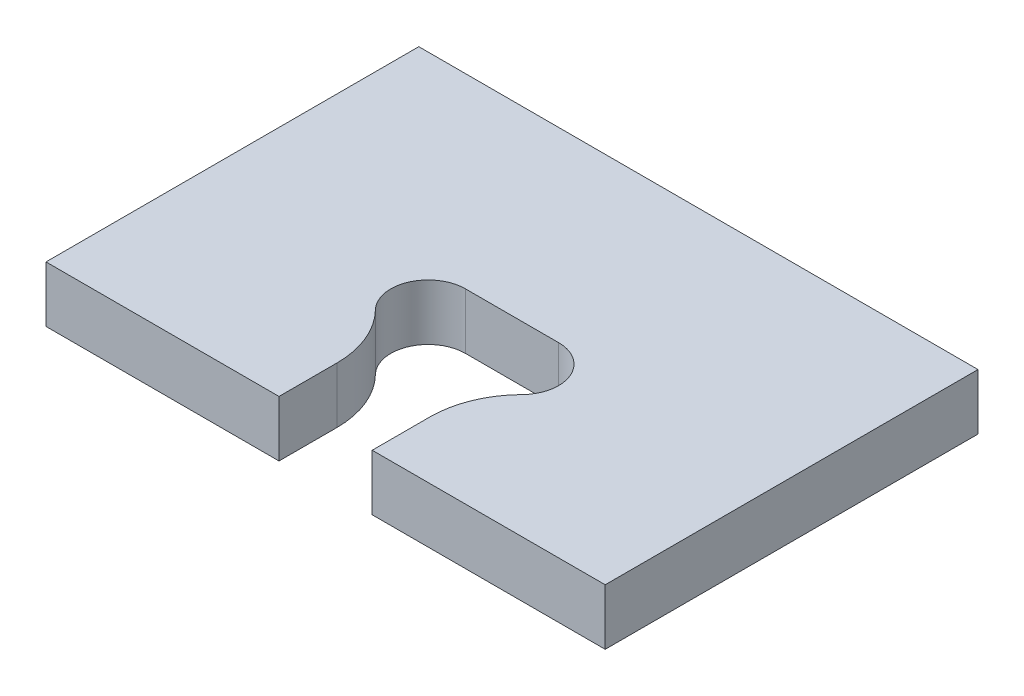
ISO-10303-21;
HEADER;
FILE_DESCRIPTION(('STEP AP214'),'2;1');
FILE_NAME('part.step','',(''),(''),'','','');
FILE_SCHEMA(('AUTOMOTIVE_DESIGN { 1 0 10303 214 1 1 1 1 }'));
ENDSEC;
DATA;
#1=APPLICATION_CONTEXT('core data for automotive mechanical design processes');
#2=APPLICATION_PROTOCOL_DEFINITION('international standard','automotive_design',2000,#1);
#3=PRODUCT_CONTEXT('',#1,'mechanical');
#4=PRODUCT('Part','Part','',(#3));
#5=PRODUCT_RELATED_PRODUCT_CATEGORY('part','',(#4));
#6=PRODUCT_DEFINITION_FORMATION('','',#4);
#7=PRODUCT_DEFINITION_CONTEXT('part definition',#1,'design');
#8=PRODUCT_DEFINITION('design','',#6,#7);
#9=PRODUCT_DEFINITION_SHAPE('','',#8);
#10=(LENGTH_UNIT() NAMED_UNIT(*) SI_UNIT(.MILLI.,.METRE.));
#11=(NAMED_UNIT(*) PLANE_ANGLE_UNIT() SI_UNIT($,.RADIAN.));
#12=(NAMED_UNIT(*) SI_UNIT($,.STERADIAN.) SOLID_ANGLE_UNIT());
#13=UNCERTAINTY_MEASURE_WITH_UNIT(LENGTH_MEASURE(1.E-05),#10,'distance_accuracy_value','');
#14=(GEOMETRIC_REPRESENTATION_CONTEXT(3) GLOBAL_UNCERTAINTY_ASSIGNED_CONTEXT((#13)) GLOBAL_UNIT_ASSIGNED_CONTEXT((#10,
#11,#12)) REPRESENTATION_CONTEXT('',''));
#15=CARTESIAN_POINT('',(0.,0.,0.));
#16=DIRECTION('',(0.,0.,1.));
#17=DIRECTION('',(1.,0.,0.));
#18=AXIS2_PLACEMENT_3D('',#15,#16,#17);
#19=CARTESIAN_POINT('',(-15.,3.,-20.));
#20=DIRECTION('',(1.,0.,0.));
#21=DIRECTION('',(0.,0.,-1.));
#22=AXIS2_PLACEMENT_3D('',#19,#20,#21);
#23=PLANE('',#22);
#24=DIRECTION('',(0.,0.,1.));
#25=VECTOR('',#24,1.);
#26=CARTESIAN_POINT('',(-15.,0.,-20.));
#27=LINE('',#26,#25);
#28=CARTESIAN_POINT('',(-15.,0.,-20.));
#29=VERTEX_POINT('',#28);
#30=CARTESIAN_POINT('',(-15.,0.,0.));
#31=VERTEX_POINT('',#30);
#32=EDGE_CURVE('E164',#29,#31,#27,.T.);
#33=ORIENTED_EDGE('',*,*,#32,.T.);
#34=DIRECTION('',(0.,-1.,0.));
#35=VECTOR('',#34,1.);
#36=CARTESIAN_POINT('',(-15.,3.,0.));
#37=LINE('',#36,#35);
#38=CARTESIAN_POINT('',(-15.,3.,0.));
#39=VERTEX_POINT('',#38);
#40=EDGE_CURVE('E11',#39,#31,#37,.T.);
#41=ORIENTED_EDGE('',*,*,#40,.F.);
#42=DIRECTION('',(0.,0.,1.));
#43=VECTOR('',#42,1.);
#44=CARTESIAN_POINT('',(-15.,3.,-20.));
#45=LINE('',#44,#43);
#46=CARTESIAN_POINT('',(-15.,3.,-20.));
#47=VERTEX_POINT('',#46);
#48=EDGE_CURVE('E198',#47,#39,#45,.T.);
#49=ORIENTED_EDGE('',*,*,#48,.F.);
#50=DIRECTION('',(0.,-1.,0.));
#51=VECTOR('',#50,1.);
#52=CARTESIAN_POINT('',(-15.,3.,-20.));
#53=LINE('',#52,#51);
#54=EDGE_CURVE('E160',#47,#29,#53,.T.);
#55=ORIENTED_EDGE('',*,*,#54,.T.);
#56=EDGE_LOOP('',(#33,#41,#49,#55));
#57=FACE_BOUND('',#56,.T.);
#58=ADVANCED_FACE('F39',(#57),#23,.F.);
#59=CARTESIAN_POINT('',(-15.,3.,0.));
#60=DIRECTION('',(0.,0.,-1.));
#61=DIRECTION('',(-1.,0.,0.));
#62=AXIS2_PLACEMENT_3D('',#59,#60,#61);
#63=PLANE('',#62);
#64=DIRECTION('',(1.,0.,0.));
#65=VECTOR('',#64,1.);
#66=CARTESIAN_POINT('',(-15.,0.,0.));
#67=LINE('',#66,#65);
#68=CARTESIAN_POINT('',(-2.5,0.,0.));
#69=VERTEX_POINT('',#68);
#70=EDGE_CURVE('E168',#31,#69,#67,.T.);
#71=ORIENTED_EDGE('',*,*,#70,.T.);
#72=DIRECTION('',(0.,-1.,0.));
#73=VECTOR('',#72,1.);
#74=CARTESIAN_POINT('',(-2.5,3.,0.));
#75=LINE('',#74,#73);
#76=CARTESIAN_POINT('',(-2.5,3.,0.));
#77=VERTEX_POINT('',#76);
#78=EDGE_CURVE('E48',#77,#69,#75,.T.);
#79=ORIENTED_EDGE('',*,*,#78,.F.);
#80=DIRECTION('',(1.,0.,0.));
#81=VECTOR('',#80,1.);
#82=CARTESIAN_POINT('',(-15.,3.,0.));
#83=LINE('',#82,#81);
#84=EDGE_CURVE('E111',#39,#77,#83,.T.);
#85=ORIENTED_EDGE('',*,*,#84,.F.);
#86=ORIENTED_EDGE('',*,*,#40,.T.);
#87=EDGE_LOOP('',(#71,#79,#85,#86));
#88=FACE_BOUND('',#87,.T.);
#89=ADVANCED_FACE('F292',(#88),#63,.F.);
#90=CARTESIAN_POINT('',(-2.5,3.,0.));
#91=DIRECTION('',(-1.,0.,0.));
#92=DIRECTION('',(0.,0.,1.));
#93=AXIS2_PLACEMENT_3D('',#90,#91,#92);
#94=PLANE('',#93);
#95=DIRECTION('',(0.,0.,-1.));
#96=VECTOR('',#95,1.);
#97=CARTESIAN_POINT('',(-2.5,0.,0.));
#98=LINE('',#97,#96);
#99=CARTESIAN_POINT('',(-2.5,0.,-3.10102051443364));
#100=VERTEX_POINT('',#99);
#101=EDGE_CURVE('E171',#69,#100,#98,.T.);
#102=ORIENTED_EDGE('',*,*,#101,.T.);
#103=DIRECTION('',(0.,-1.,0.));
#104=VECTOR('',#103,1.);
#105=CARTESIAN_POINT('',(-2.5,3.,-3.10102051443364));
#106=LINE('',#105,#104);
#107=CARTESIAN_POINT('',(-2.5,3.,-3.10102051443364));
#108=VERTEX_POINT('',#107);
#109=EDGE_CURVE('E225',#108,#100,#106,.T.);
#110=ORIENTED_EDGE('',*,*,#109,.F.);
#111=DIRECTION('',(0.,0.,-1.));
#112=VECTOR('',#111,1.);
#113=CARTESIAN_POINT('',(-2.5,3.,0.));
#114=LINE('',#113,#112);
#115=EDGE_CURVE('E235',#77,#108,#114,.T.);
#116=ORIENTED_EDGE('',*,*,#115,.F.);
#117=ORIENTED_EDGE('',*,*,#78,.T.);
#118=EDGE_LOOP('',(#102,#110,#116,#117));
#119=FACE_BOUND('',#118,.T.);
#120=ADVANCED_FACE('F233',(#119),#94,.F.);
#121=CARTESIAN_POINT('',(-7.5,3.,-3.10102051443365));
#122=DIRECTION('',(0.,-1.,0.));
#123=DIRECTION('',(0.,0.,-1.));
#124=AXIS2_PLACEMENT_3D('',#121,#122,#123);
#125=CYLINDRICAL_SURFACE('',#124,5.);
#126=CARTESIAN_POINT('',(-7.5,0.,-3.10102051443365));
#127=DIRECTION('',(0.,1.,0.));
#128=DIRECTION('',(0.,0.,1.));
#129=AXIS2_PLACEMENT_3D('',#126,#127,#128);
#130=CIRCLE('',#129,5.);
#131=CARTESIAN_POINT('',(-3.92857142857143,0.,-6.60029157555247));
#132=VERTEX_POINT('',#131);
#133=EDGE_CURVE('E174',#100,#132,#130,.T.);
#134=ORIENTED_EDGE('',*,*,#133,.T.);
#135=DIRECTION('',(0.,-1.,0.));
#136=VECTOR('',#135,1.);
#137=CARTESIAN_POINT('',(-3.92857142857143,3.,-6.60029157555247));
#138=LINE('',#137,#136);
#139=CARTESIAN_POINT('',(-3.92857142857143,3.,-6.60029157555247));
#140=VERTEX_POINT('',#139);
#141=EDGE_CURVE('E221',#140,#132,#138,.T.);
#142=ORIENTED_EDGE('',*,*,#141,.F.);
#143=CARTESIAN_POINT('',(-7.5,3.,-3.10102051443365));
#144=DIRECTION('',(0.,1.,0.));
#145=DIRECTION('',(0.,0.,1.));
#146=AXIS2_PLACEMENT_3D('',#143,#144,#145);
#147=CIRCLE('',#146,5.);
#148=EDGE_CURVE('E254',#108,#140,#147,.T.);
#149=ORIENTED_EDGE('',*,*,#148,.F.);
#150=ORIENTED_EDGE('',*,*,#109,.T.);
#151=EDGE_LOOP('',(#134,#142,#149,#150));
#152=FACE_BOUND('',#151,.T.);
#153=ADVANCED_FACE('F244',(#152),#125,.T.);
#154=CARTESIAN_POINT('',(-2.5,3.,-8.));
#155=DIRECTION('',(0.,-1.,0.));
#156=DIRECTION('',(0.,0.,-1.));
#157=AXIS2_PLACEMENT_3D('',#154,#155,#156);
#158=CYLINDRICAL_SURFACE('',#157,2.);
#159=CARTESIAN_POINT('',(-2.5,0.,-8.));
#160=DIRECTION('',(0.,-1.,0.));
#161=DIRECTION('',(0.,0.,-1.));
#162=AXIS2_PLACEMENT_3D('',#159,#160,#161);
#163=CIRCLE('',#162,2.);
#164=CARTESIAN_POINT('',(-2.5,0.,-10.));
#165=VERTEX_POINT('',#164);
#166=EDGE_CURVE('E177',#132,#165,#163,.T.);
#167=ORIENTED_EDGE('',*,*,#166,.T.);
#168=DIRECTION('',(0.,-1.,0.));
#169=VECTOR('',#168,1.);
#170=CARTESIAN_POINT('',(-2.5,3.,-10.));
#171=LINE('',#170,#169);
#172=CARTESIAN_POINT('',(-2.5,3.,-10.));
#173=VERTEX_POINT('',#172);
#174=EDGE_CURVE('E217',#173,#165,#171,.T.);
#175=ORIENTED_EDGE('',*,*,#174,.F.);
#176=CARTESIAN_POINT('',(-2.5,3.,-8.));
#177=DIRECTION('',(0.,-1.,0.));
#178=DIRECTION('',(0.,0.,-1.));
#179=AXIS2_PLACEMENT_3D('',#176,#177,#178);
#180=CIRCLE('',#179,2.);
#181=EDGE_CURVE('E250',#140,#173,#180,.T.);
#182=ORIENTED_EDGE('',*,*,#181,.F.);
#183=ORIENTED_EDGE('',*,*,#141,.T.);
#184=EDGE_LOOP('',(#167,#175,#182,#183));
#185=FACE_BOUND('',#184,.T.);
#186=ADVANCED_FACE('F248',(#185),#158,.F.);
#187=CARTESIAN_POINT('',(-2.5,3.,-10.));
#188=DIRECTION('',(0.,0.,-1.));
#189=DIRECTION('',(-1.,0.,0.));
#190=AXIS2_PLACEMENT_3D('',#187,#188,#189);
#191=PLANE('',#190);
#192=DIRECTION('',(1.,0.,0.));
#193=VECTOR('',#192,1.);
#194=CARTESIAN_POINT('',(-2.5,0.,-10.));
#195=LINE('',#194,#193);
#196=CARTESIAN_POINT('',(2.5,0.,-10.));
#197=VERTEX_POINT('',#196);
#198=EDGE_CURVE('E180',#165,#197,#195,.T.);
#199=ORIENTED_EDGE('',*,*,#198,.T.);
#200=DIRECTION('',(0.,-1.,0.));
#201=VECTOR('',#200,1.);
#202=CARTESIAN_POINT('',(2.5,3.,-10.));
#203=LINE('',#202,#201);
#204=CARTESIAN_POINT('',(2.5,3.,-10.));
#205=VERTEX_POINT('',#204);
#206=EDGE_CURVE('E213',#205,#197,#203,.T.);
#207=ORIENTED_EDGE('',*,*,#206,.F.);
#208=DIRECTION('',(1.,0.,0.));
#209=VECTOR('',#208,1.);
#210=CARTESIAN_POINT('',(-2.5,3.,-10.));
#211=LINE('',#210,#209);
#212=EDGE_CURVE('E253',#173,#205,#211,.T.);
#213=ORIENTED_EDGE('',*,*,#212,.F.);
#214=ORIENTED_EDGE('',*,*,#174,.T.);
#215=EDGE_LOOP('',(#199,#207,#213,#214));
#216=FACE_BOUND('',#215,.T.);
#217=ADVANCED_FACE('F305',(#216),#191,.F.);
#218=CARTESIAN_POINT('',(2.5,3.,-8.));
#219=DIRECTION('',(0.,-1.,0.));
#220=DIRECTION('',(0.,0.,-1.));
#221=AXIS2_PLACEMENT_3D('',#218,#219,#220);
#222=CYLINDRICAL_SURFACE('',#221,2.);
#223=CARTESIAN_POINT('',(2.5,0.,-8.));
#224=DIRECTION('',(0.,-1.,0.));
#225=DIRECTION('',(0.,0.,-1.));
#226=AXIS2_PLACEMENT_3D('',#223,#224,#225);
#227=CIRCLE('',#226,2.);
#228=CARTESIAN_POINT('',(3.92857142857143,0.,-6.60029157555247));
#229=VERTEX_POINT('',#228);
#230=EDGE_CURVE('E183',#197,#229,#227,.T.);
#231=ORIENTED_EDGE('',*,*,#230,.T.);
#232=DIRECTION('',(0.,-1.,0.));
#233=VECTOR('',#232,1.);
#234=CARTESIAN_POINT('',(3.92857142857143,3.,-6.60029157555247));
#235=LINE('',#234,#233);
#236=CARTESIAN_POINT('',(3.92857142857143,3.,-6.60029157555247));
#237=VERTEX_POINT('',#236);
#238=EDGE_CURVE('E209',#237,#229,#235,.T.);
#239=ORIENTED_EDGE('',*,*,#238,.F.);
#240=CARTESIAN_POINT('',(2.5,3.,-8.));
#241=DIRECTION('',(0.,-1.,0.));
#242=DIRECTION('',(0.,0.,-1.));
#243=AXIS2_PLACEMENT_3D('',#240,#241,#242);
#244=CIRCLE('',#243,2.);
#245=EDGE_CURVE('E258',#205,#237,#244,.T.);
#246=ORIENTED_EDGE('',*,*,#245,.F.);
#247=ORIENTED_EDGE('',*,*,#206,.T.);
#248=EDGE_LOOP('',(#231,#239,#246,#247));
#249=FACE_BOUND('',#248,.T.);
#250=ADVANCED_FACE('F308',(#249),#222,.F.);
#251=CARTESIAN_POINT('',(7.5,3.,-3.10102051443365));
#252=DIRECTION('',(0.,-1.,0.));
#253=DIRECTION('',(0.,0.,-1.));
#254=AXIS2_PLACEMENT_3D('',#251,#252,#253);
#255=CYLINDRICAL_SURFACE('',#254,5.);
#256=CARTESIAN_POINT('',(7.5,0.,-3.10102051443365));
#257=DIRECTION('',(0.,1.,0.));
#258=DIRECTION('',(0.,0.,1.));
#259=AXIS2_PLACEMENT_3D('',#256,#257,#258);
#260=CIRCLE('',#259,5.);
#261=CARTESIAN_POINT('',(2.5,0.,-3.10102051443365));
#262=VERTEX_POINT('',#261);
#263=EDGE_CURVE('E186',#229,#262,#260,.T.);
#264=ORIENTED_EDGE('',*,*,#263,.T.);
#265=DIRECTION('',(0.,-1.,0.));
#266=VECTOR('',#265,1.);
#267=CARTESIAN_POINT('',(2.5,3.,-3.10102051443365));
#268=LINE('',#267,#266);
#269=CARTESIAN_POINT('',(2.5,3.,-3.10102051443365));
#270=VERTEX_POINT('',#269);
#271=EDGE_CURVE('E205',#270,#262,#268,.T.);
#272=ORIENTED_EDGE('',*,*,#271,.F.);
#273=CARTESIAN_POINT('',(7.5,3.,-3.10102051443365));
#274=DIRECTION('',(0.,1.,0.));
#275=DIRECTION('',(0.,0.,1.));
#276=AXIS2_PLACEMENT_3D('',#273,#274,#275);
#277=CIRCLE('',#276,5.);
#278=EDGE_CURVE('E265',#237,#270,#277,.T.);
#279=ORIENTED_EDGE('',*,*,#278,.F.);
#280=ORIENTED_EDGE('',*,*,#238,.T.);
#281=EDGE_LOOP('',(#264,#272,#279,#280));
#282=FACE_BOUND('',#281,.T.);
#283=ADVANCED_FACE('F273',(#282),#255,.T.);
#284=CARTESIAN_POINT('',(2.5,3.,-3.10102051443365));
#285=DIRECTION('',(1.,0.,0.));
#286=DIRECTION('',(0.,0.,-1.));
#287=AXIS2_PLACEMENT_3D('',#284,#285,#286);
#288=PLANE('',#287);
#289=DIRECTION('',(0.,0.,1.));
#290=VECTOR('',#289,1.);
#291=CARTESIAN_POINT('',(2.5,0.,-3.10102051443365));
#292=LINE('',#291,#290);
#293=CARTESIAN_POINT('',(2.5,0.,0.));
#294=VERTEX_POINT('',#293);
#295=EDGE_CURVE('E189',#262,#294,#292,.T.);
#296=ORIENTED_EDGE('',*,*,#295,.T.);
#297=DIRECTION('',(0.,-1.,0.));
#298=VECTOR('',#297,1.);
#299=CARTESIAN_POINT('',(2.5,3.,0.));
#300=LINE('',#299,#298);
#301=CARTESIAN_POINT('',(2.5,3.,0.));
#302=VERTEX_POINT('',#301);
#303=EDGE_CURVE('E153',#302,#294,#300,.T.);
#304=ORIENTED_EDGE('',*,*,#303,.F.);
#305=DIRECTION('',(0.,0.,1.));
#306=VECTOR('',#305,1.);
#307=CARTESIAN_POINT('',(2.5,3.,-3.10102051443365));
#308=LINE('',#307,#306);
#309=EDGE_CURVE('E142',#270,#302,#308,.T.);
#310=ORIENTED_EDGE('',*,*,#309,.F.);
#311=ORIENTED_EDGE('',*,*,#271,.T.);
#312=EDGE_LOOP('',(#296,#304,#310,#311));
#313=FACE_BOUND('',#312,.T.);
#314=ADVANCED_FACE('F277',(#313),#288,.F.);
#315=CARTESIAN_POINT('',(2.5,3.,0.));
#316=DIRECTION('',(0.,0.,-1.));
#317=DIRECTION('',(-1.,0.,0.));
#318=AXIS2_PLACEMENT_3D('',#315,#316,#317);
#319=PLANE('',#318);
#320=DIRECTION('',(1.,0.,0.));
#321=VECTOR('',#320,1.);
#322=CARTESIAN_POINT('',(2.5,0.,0.));
#323=LINE('',#322,#321);
#324=CARTESIAN_POINT('',(15.,0.,0.));
#325=VERTEX_POINT('',#324);
#326=EDGE_CURVE('E151',#294,#325,#323,.T.);
#327=ORIENTED_EDGE('',*,*,#326,.T.);
#328=DIRECTION('',(0.,-1.,0.));
#329=VECTOR('',#328,1.);
#330=CARTESIAN_POINT('',(15.,3.,0.));
#331=LINE('',#330,#329);
#332=CARTESIAN_POINT('',(15.,3.,0.));
#333=VERTEX_POINT('',#332);
#334=EDGE_CURVE('E148',#333,#325,#331,.T.);
#335=ORIENTED_EDGE('',*,*,#334,.F.);
#336=DIRECTION('',(1.,0.,0.));
#337=VECTOR('',#336,1.);
#338=CARTESIAN_POINT('',(2.5,3.,0.));
#339=LINE('',#338,#337);
#340=EDGE_CURVE('E136',#302,#333,#339,.T.);
#341=ORIENTED_EDGE('',*,*,#340,.F.);
#342=ORIENTED_EDGE('',*,*,#303,.T.);
#343=EDGE_LOOP('',(#327,#335,#341,#342));
#344=FACE_BOUND('',#343,.T.);
#345=ADVANCED_FACE('F149',(#344),#319,.F.);
#346=CARTESIAN_POINT('',(15.,3.,-20.));
#347=DIRECTION('',(-1.,0.,0.));
#348=DIRECTION('',(0.,0.,1.));
#349=AXIS2_PLACEMENT_3D('',#346,#347,#348);
#350=PLANE('',#349);
#351=DIRECTION('',(0.,0.,-1.));
#352=VECTOR('',#351,1.);
#353=CARTESIAN_POINT('',(15.,0.,-20.));
#354=LINE('',#353,#352);
#355=CARTESIAN_POINT('',(15.,0.,-20.));
#356=VERTEX_POINT('',#355);
#357=EDGE_CURVE('E97',#325,#356,#354,.T.);
#358=ORIENTED_EDGE('',*,*,#357,.T.);
#359=DIRECTION('',(0.,-1.,0.));
#360=VECTOR('',#359,1.);
#361=CARTESIAN_POINT('',(15.,3.,-20.));
#362=LINE('',#361,#360);
#363=CARTESIAN_POINT('',(15.,3.,-20.));
#364=VERTEX_POINT('',#363);
#365=EDGE_CURVE('E154',#364,#356,#362,.T.);
#366=ORIENTED_EDGE('',*,*,#365,.F.);
#367=DIRECTION('',(0.,0.,-1.));
#368=VECTOR('',#367,1.);
#369=CARTESIAN_POINT('',(15.,3.,-20.));
#370=LINE('',#369,#368);
#371=EDGE_CURVE('E140',#333,#364,#370,.T.);
#372=ORIENTED_EDGE('',*,*,#371,.F.);
#373=ORIENTED_EDGE('',*,*,#334,.T.);
#374=EDGE_LOOP('',(#358,#366,#372,#373));
#375=FACE_BOUND('',#374,.T.);
#376=ADVANCED_FACE('F156',(#375),#350,.F.);
#377=CARTESIAN_POINT('',(-15.,3.,-20.));
#378=DIRECTION('',(0.,0.,1.));
#379=DIRECTION('',(1.,0.,0.));
#380=AXIS2_PLACEMENT_3D('',#377,#378,#379);
#381=PLANE('',#380);
#382=DIRECTION('',(-1.,0.,0.));
#383=VECTOR('',#382,1.);
#384=CARTESIAN_POINT('',(-15.,0.,-20.));
#385=LINE('',#384,#383);
#386=EDGE_CURVE('E103',#356,#29,#385,.T.);
#387=ORIENTED_EDGE('',*,*,#386,.T.);
#388=ORIENTED_EDGE('',*,*,#54,.F.);
#389=DIRECTION('',(-1.,0.,0.));
#390=VECTOR('',#389,1.);
#391=CARTESIAN_POINT('',(-15.,3.,-20.));
#392=LINE('',#391,#390);
#393=EDGE_CURVE('E56',#364,#47,#392,.T.);
#394=ORIENTED_EDGE('',*,*,#393,.F.);
#395=ORIENTED_EDGE('',*,*,#365,.T.);
#396=EDGE_LOOP('',(#387,#388,#394,#395));
#397=FACE_BOUND('',#396,.T.);
#398=ADVANCED_FACE('F281',(#397),#381,.F.);
#399=CARTESIAN_POINT('',(-7.5,3.,-3.10102051443365));
#400=DIRECTION('',(0.,1.,0.));
#401=DIRECTION('',(0.,0.,1.));
#402=AXIS2_PLACEMENT_3D('',#399,#400,#401);
#403=PLANE('',#402);
#404=ORIENTED_EDGE('',*,*,#48,.T.);
#405=ORIENTED_EDGE('',*,*,#84,.T.);
#406=ORIENTED_EDGE('',*,*,#115,.T.);
#407=ORIENTED_EDGE('',*,*,#148,.T.);
#408=ORIENTED_EDGE('',*,*,#181,.T.);
#409=ORIENTED_EDGE('',*,*,#212,.T.);
#410=ORIENTED_EDGE('',*,*,#245,.T.);
#411=ORIENTED_EDGE('',*,*,#278,.T.);
#412=ORIENTED_EDGE('',*,*,#309,.T.);
#413=ORIENTED_EDGE('',*,*,#340,.T.);
#414=ORIENTED_EDGE('',*,*,#371,.T.);
#415=ORIENTED_EDGE('',*,*,#393,.T.);
#416=EDGE_LOOP('',(#404,#405,#406,#407,#408,#409,#410,#411,#412,#413,#414,#415));
#417=FACE_BOUND('',#416,.T.);
#418=ADVANCED_FACE('F138',(#417),#403,.T.);
#419=CARTESIAN_POINT('',(-7.5,0.,-3.10102051443365));
#420=DIRECTION('',(0.,1.,0.));
#421=DIRECTION('',(0.,0.,1.));
#422=AXIS2_PLACEMENT_3D('',#419,#420,#421);
#423=PLANE('',#422);
#424=ORIENTED_EDGE('',*,*,#32,.F.);
#425=ORIENTED_EDGE('',*,*,#386,.F.);
#426=ORIENTED_EDGE('',*,*,#357,.F.);
#427=ORIENTED_EDGE('',*,*,#326,.F.);
#428=ORIENTED_EDGE('',*,*,#295,.F.);
#429=ORIENTED_EDGE('',*,*,#263,.F.);
#430=ORIENTED_EDGE('',*,*,#230,.F.);
#431=ORIENTED_EDGE('',*,*,#198,.F.);
#432=ORIENTED_EDGE('',*,*,#166,.F.);
#433=ORIENTED_EDGE('',*,*,#133,.F.);
#434=ORIENTED_EDGE('',*,*,#101,.F.);
#435=ORIENTED_EDGE('',*,*,#70,.F.);
#436=EDGE_LOOP('',(#424,#425,#426,#427,#428,#429,#430,#431,#432,#433,#434,#435));
#437=FACE_BOUND('',#436,.T.);
#438=ADVANCED_FACE('F239',(#437),#423,.F.);
#439=CLOSED_SHELL('',(#58,#89,#120,#153,#186,#217,#250,#283,#314,#345,#376,#398,#418,#438));
#440=MANIFOLD_SOLID_BREP('B2',#439);
#441=ADVANCED_BREP_SHAPE_REPRESENTATION('',(#18,#440),#14);
#442=SHAPE_DEFINITION_REPRESENTATION(#9,#441);
ENDSEC;
END-ISO-10303-21;
